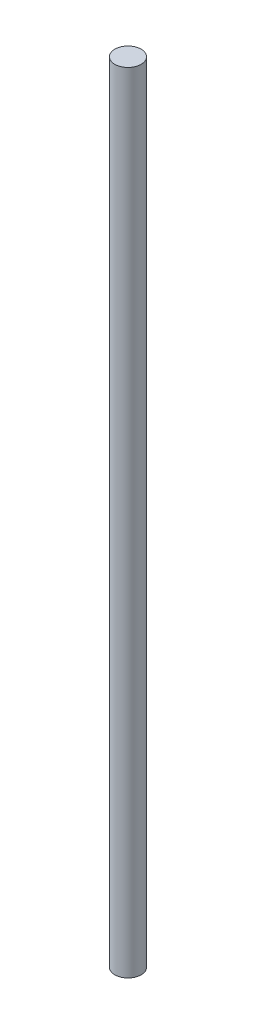
ISO-10303-21;
HEADER;
FILE_DESCRIPTION(('STEP AP214'),'2;1');
FILE_NAME('part.step','',(''),(''),'','','');
FILE_SCHEMA(('AUTOMOTIVE_DESIGN { 1 0 10303 214 1 1 1 1 }'));
ENDSEC;
DATA;
#1=APPLICATION_CONTEXT('core data for automotive mechanical design processes');
#2=APPLICATION_PROTOCOL_DEFINITION('international standard','automotive_design',2000,#1);
#3=PRODUCT_CONTEXT('',#1,'mechanical');
#4=PRODUCT('Part','Part','',(#3));
#5=PRODUCT_RELATED_PRODUCT_CATEGORY('part','',(#4));
#6=PRODUCT_DEFINITION_FORMATION('','',#4);
#7=PRODUCT_DEFINITION_CONTEXT('part definition',#1,'design');
#8=PRODUCT_DEFINITION('design','',#6,#7);
#9=PRODUCT_DEFINITION_SHAPE('','',#8);
#10=(LENGTH_UNIT() NAMED_UNIT(*) SI_UNIT(.MILLI.,.METRE.));
#11=(NAMED_UNIT(*) PLANE_ANGLE_UNIT() SI_UNIT($,.RADIAN.));
#12=(NAMED_UNIT(*) SI_UNIT($,.STERADIAN.) SOLID_ANGLE_UNIT());
#13=UNCERTAINTY_MEASURE_WITH_UNIT(LENGTH_MEASURE(1.E-05),#10,'distance_accuracy_value','');
#14=(GEOMETRIC_REPRESENTATION_CONTEXT(3) GLOBAL_UNCERTAINTY_ASSIGNED_CONTEXT((#13)) GLOBAL_UNIT_ASSIGNED_CONTEXT((#10,
#11,#12)) REPRESENTATION_CONTEXT('',''));
#15=CARTESIAN_POINT('',(0.,0.,0.));
#16=DIRECTION('',(0.,0.,1.));
#17=DIRECTION('',(1.,0.,0.));
#18=AXIS2_PLACEMENT_3D('',#15,#16,#17);
#19=CARTESIAN_POINT('',(0.,120.,0.));
#20=DIRECTION('',(0.,-1.,0.));
#21=DIRECTION('',(0.,0.,-1.));
#22=AXIS2_PLACEMENT_3D('',#19,#20,#21);
#23=CYLINDRICAL_SURFACE('',#22,2.);
#24=CARTESIAN_POINT('',(0.,120.,0.));
#25=DIRECTION('',(0.,1.,0.));
#26=DIRECTION('',(0.,0.,1.));
#27=AXIS2_PLACEMENT_3D('',#24,#25,#26);
#28=CIRCLE('',#27,2.);
#29=CARTESIAN_POINT('',(0.,120.,2.));
#30=VERTEX_POINT('',#29);
#31=EDGE_CURVE('E10',#30,#30,#28,.T.);
#32=ORIENTED_EDGE('',*,*,#31,.F.);
#33=EDGE_LOOP('',(#32));
#34=FACE_BOUND('',#33,.T.);
#35=CARTESIAN_POINT('',(0.,0.,0.));
#36=DIRECTION('',(0.,1.,0.));
#37=DIRECTION('',(0.,0.,1.));
#38=AXIS2_PLACEMENT_3D('',#35,#36,#37);
#39=CIRCLE('',#38,2.);
#40=CARTESIAN_POINT('',(0.,0.,2.));
#41=VERTEX_POINT('',#40);
#42=EDGE_CURVE('E38',#41,#41,#39,.T.);
#43=ORIENTED_EDGE('',*,*,#42,.T.);
#44=EDGE_LOOP('',(#43));
#45=FACE_BOUND('',#44,.T.);
#46=ADVANCED_FACE('F35',(#34,#45),#23,.T.);
#47=CARTESIAN_POINT('',(0.,120.,0.));
#48=DIRECTION('',(0.,1.,0.));
#49=DIRECTION('',(0.,0.,1.));
#50=AXIS2_PLACEMENT_3D('',#47,#48,#49);
#51=PLANE('',#50);
#52=ORIENTED_EDGE('',*,*,#31,.T.);
#53=EDGE_LOOP('',(#52));
#54=FACE_BOUND('',#53,.T.);
#55=ADVANCED_FACE('F50',(#54),#51,.T.);
#56=CARTESIAN_POINT('',(0.,0.,0.));
#57=DIRECTION('',(0.,1.,0.));
#58=DIRECTION('',(0.,0.,1.));
#59=AXIS2_PLACEMENT_3D('',#56,#57,#58);
#60=PLANE('',#59);
#61=ORIENTED_EDGE('',*,*,#42,.F.);
#62=EDGE_LOOP('',(#61));
#63=FACE_BOUND('',#62,.T.);
#64=ADVANCED_FACE('F48',(#63),#60,.F.);
#65=CLOSED_SHELL('',(#46,#55,#64));
#66=MANIFOLD_SOLID_BREP('B2',#65);
#67=ADVANCED_BREP_SHAPE_REPRESENTATION('',(#18,#66),#14);
#68=SHAPE_DEFINITION_REPRESENTATION(#9,#67);
ENDSEC;
END-ISO-10303-21;
